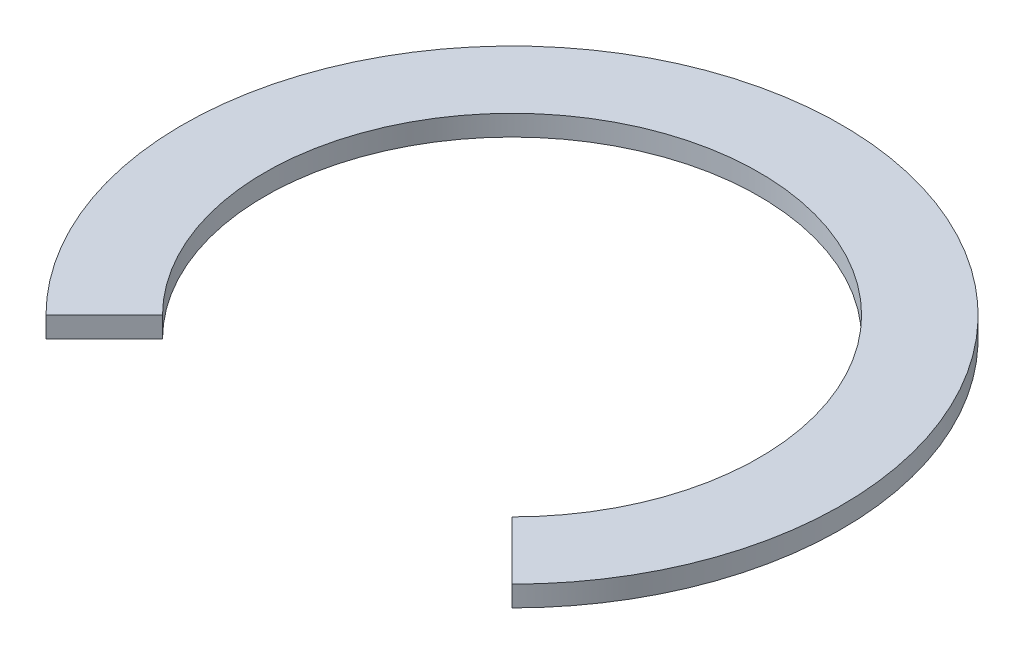
ISO-10303-21;
HEADER;
FILE_DESCRIPTION(('STEP AP214'),'2;1');
FILE_NAME('part.step','',(''),(''),'','','');
FILE_SCHEMA(('AUTOMOTIVE_DESIGN { 1 0 10303 214 1 1 1 1 }'));
ENDSEC;
DATA;
#1=APPLICATION_CONTEXT('core data for automotive mechanical design processes');
#2=APPLICATION_PROTOCOL_DEFINITION('international standard','automotive_design',2000,#1);
#3=PRODUCT_CONTEXT('',#1,'mechanical');
#4=PRODUCT('Part','Part','',(#3));
#5=PRODUCT_RELATED_PRODUCT_CATEGORY('part','',(#4));
#6=PRODUCT_DEFINITION_FORMATION('','',#4);
#7=PRODUCT_DEFINITION_CONTEXT('part definition',#1,'design');
#8=PRODUCT_DEFINITION('design','',#6,#7);
#9=PRODUCT_DEFINITION_SHAPE('','',#8);
#10=(LENGTH_UNIT() NAMED_UNIT(*) SI_UNIT(.MILLI.,.METRE.));
#11=(NAMED_UNIT(*) PLANE_ANGLE_UNIT() SI_UNIT($,.RADIAN.));
#12=(NAMED_UNIT(*) SI_UNIT($,.STERADIAN.) SOLID_ANGLE_UNIT());
#13=UNCERTAINTY_MEASURE_WITH_UNIT(LENGTH_MEASURE(1.E-05),#10,'distance_accuracy_value','');
#14=(GEOMETRIC_REPRESENTATION_CONTEXT(3) GLOBAL_UNCERTAINTY_ASSIGNED_CONTEXT((#13)) GLOBAL_UNIT_ASSIGNED_CONTEXT((#10,
#11,#12)) REPRESENTATION_CONTEXT('',''));
#15=CARTESIAN_POINT('',(0.,0.,0.));
#16=DIRECTION('',(0.,0.,1.));
#17=DIRECTION('',(1.,0.,0.));
#18=AXIS2_PLACEMENT_3D('',#15,#16,#17);
#19=CARTESIAN_POINT('',(0.,0.79375,0.));
#20=DIRECTION('',(0.,-1.,0.));
#21=DIRECTION('',(0.,0.,-1.));
#22=AXIS2_PLACEMENT_3D('',#19,#20,#21);
#23=CYLINDRICAL_SURFACE('',#22,12.7);
#24=CARTESIAN_POINT('',(0.,0.79375,0.));
#25=DIRECTION('',(0.,1.,0.));
#26=DIRECTION('',(0.,0.,1.));
#27=AXIS2_PLACEMENT_3D('',#24,#25,#26);
#28=CIRCLE('',#27,12.7);
#29=CARTESIAN_POINT('',(8.98025612106917,0.79375,8.98025612106914));
#30=VERTEX_POINT('',#29);
#31=CARTESIAN_POINT('',(-8.98025612106917,0.79375,8.98025612106914));
#32=VERTEX_POINT('',#31);
#33=EDGE_CURVE('E77',#30,#32,#28,.T.);
#34=ORIENTED_EDGE('',*,*,#33,.F.);
#35=DIRECTION('',(0.,-1.,0.));
#36=VECTOR('',#35,1.);
#37=CARTESIAN_POINT('',(8.98025612106917,0.79375,8.98025612106914));
#38=LINE('',#37,#36);
#39=CARTESIAN_POINT('',(8.98025612106917,0.,8.98025612106914));
#40=VERTEX_POINT('',#39);
#41=EDGE_CURVE('E88',#30,#40,#38,.T.);
#42=ORIENTED_EDGE('',*,*,#41,.T.);
#43=CARTESIAN_POINT('',(0.,0.,0.));
#44=DIRECTION('',(0.,1.,0.));
#45=DIRECTION('',(0.,0.,1.));
#46=AXIS2_PLACEMENT_3D('',#43,#44,#45);
#47=CIRCLE('',#46,12.7);
#48=CARTESIAN_POINT('',(-8.98025612106917,0.,8.98025612106914));
#49=VERTEX_POINT('',#48);
#50=EDGE_CURVE('E90',#40,#49,#47,.T.);
#51=ORIENTED_EDGE('',*,*,#50,.T.);
#52=DIRECTION('',(0.,-1.,0.));
#53=VECTOR('',#52,1.);
#54=CARTESIAN_POINT('',(-8.98025612106917,0.79375,8.98025612106914));
#55=LINE('',#54,#53);
#56=EDGE_CURVE('E84',#32,#49,#55,.T.);
#57=ORIENTED_EDGE('',*,*,#56,.F.);
#58=EDGE_LOOP('',(#34,#42,#51,#57));
#59=FACE_BOUND('',#58,.T.);
#60=ADVANCED_FACE('F33',(#59),#23,.T.);
#61=CARTESIAN_POINT('',(0.,0.79375,0.));
#62=DIRECTION('',(0.,1.,0.));
#63=DIRECTION('',(0.,0.,1.));
#64=AXIS2_PLACEMENT_3D('',#61,#62,#63);
#65=PLANE('',#64);
#66=DIRECTION('',(-0.707106781186549,0.,-0.707106781186546));
#67=VECTOR('',#66,1.);
#68=CARTESIAN_POINT('',(0.,0.79375,0.));
#69=LINE('',#68,#67);
#70=CARTESIAN_POINT('',(6.73519209080188,0.79375,6.73519209080185));
#71=VERTEX_POINT('',#70);
#72=EDGE_CURVE('E47',#30,#71,#69,.T.);
#73=ORIENTED_EDGE('',*,*,#72,.F.);
#74=ORIENTED_EDGE('',*,*,#33,.T.);
#75=DIRECTION('',(0.707106781186549,0.,-0.707106781186546));
#76=VECTOR('',#75,1.);
#77=CARTESIAN_POINT('',(0.,0.79375,0.));
#78=LINE('',#77,#76);
#79=CARTESIAN_POINT('',(-6.73519209080188,0.79375,6.73519209080185));
#80=VERTEX_POINT('',#79);
#81=EDGE_CURVE('E71',#32,#80,#78,.T.);
#82=ORIENTED_EDGE('',*,*,#81,.T.);
#83=CARTESIAN_POINT('',(0.,0.79375,0.));
#84=DIRECTION('',(0.,1.,0.));
#85=DIRECTION('',(0.,0.,1.));
#86=AXIS2_PLACEMENT_3D('',#83,#84,#85);
#87=CIRCLE('',#86,9.525);
#88=EDGE_CURVE('E82',#71,#80,#87,.T.);
#89=ORIENTED_EDGE('',*,*,#88,.F.);
#90=EDGE_LOOP('',(#73,#74,#82,#89));
#91=FACE_BOUND('',#90,.T.);
#92=ADVANCED_FACE('F81',(#91),#65,.T.);
#93=CARTESIAN_POINT('',(0.,0.,0.));
#94=DIRECTION('',(0.,1.,0.));
#95=DIRECTION('',(0.,0.,1.));
#96=AXIS2_PLACEMENT_3D('',#93,#94,#95);
#97=PLANE('',#96);
#98=ORIENTED_EDGE('',*,*,#50,.F.);
#99=DIRECTION('',(-0.707106781186549,0.,-0.707106781186546));
#100=VECTOR('',#99,1.);
#101=CARTESIAN_POINT('',(0.,0.,0.));
#102=LINE('',#101,#100);
#103=CARTESIAN_POINT('',(6.73519209080188,0.,6.73519209080185));
#104=VERTEX_POINT('',#103);
#105=EDGE_CURVE('E102',#40,#104,#102,.T.);
#106=ORIENTED_EDGE('',*,*,#105,.T.);
#107=CARTESIAN_POINT('',(0.,0.,0.));
#108=DIRECTION('',(0.,1.,0.));
#109=DIRECTION('',(0.,0.,1.));
#110=AXIS2_PLACEMENT_3D('',#107,#108,#109);
#111=CIRCLE('',#110,9.525);
#112=CARTESIAN_POINT('',(-6.73519209080188,0.,6.73519209080185));
#113=VERTEX_POINT('',#112);
#114=EDGE_CURVE('E87',#104,#113,#111,.T.);
#115=ORIENTED_EDGE('',*,*,#114,.T.);
#116=DIRECTION('',(0.707106781186549,0.,-0.707106781186546));
#117=VECTOR('',#116,1.);
#118=CARTESIAN_POINT('',(0.,0.,0.));
#119=LINE('',#118,#117);
#120=EDGE_CURVE('E54',#49,#113,#119,.T.);
#121=ORIENTED_EDGE('',*,*,#120,.F.);
#122=EDGE_LOOP('',(#98,#106,#115,#121));
#123=FACE_BOUND('',#122,.T.);
#124=ADVANCED_FACE('F101',(#123),#97,.F.);
#125=CARTESIAN_POINT('',(0.,0.,0.));
#126=DIRECTION('',(0.,1.,0.));
#127=DIRECTION('',(0.,0.,1.));
#128=AXIS2_PLACEMENT_3D('',#125,#126,#127);
#129=CYLINDRICAL_SURFACE('',#128,9.525);
#130=ORIENTED_EDGE('',*,*,#114,.F.);
#131=DIRECTION('',(0.,1.,0.));
#132=VECTOR('',#131,1.);
#133=CARTESIAN_POINT('',(6.73519209080188,0.,6.73519209080185));
#134=LINE('',#133,#132);
#135=EDGE_CURVE('E11',#104,#71,#134,.T.);
#136=ORIENTED_EDGE('',*,*,#135,.T.);
#137=ORIENTED_EDGE('',*,*,#88,.T.);
#138=DIRECTION('',(0.,1.,0.));
#139=VECTOR('',#138,1.);
#140=CARTESIAN_POINT('',(-6.73519209080188,0.,6.73519209080185));
#141=LINE('',#140,#139);
#142=EDGE_CURVE('E40',#113,#80,#141,.T.);
#143=ORIENTED_EDGE('',*,*,#142,.F.);
#144=EDGE_LOOP('',(#130,#136,#137,#143));
#145=FACE_BOUND('',#144,.T.);
#146=ADVANCED_FACE('F86',(#145),#129,.F.);
#147=CARTESIAN_POINT('',(0.,0.,0.));
#148=DIRECTION('',(0.707106781186546,0.,0.707106781186549));
#149=DIRECTION('',(0.707106781186549,0.,-0.707106781186546));
#150=AXIS2_PLACEMENT_3D('',#147,#148,#149);
#151=PLANE('',#150);
#152=ORIENTED_EDGE('',*,*,#56,.T.);
#153=ORIENTED_EDGE('',*,*,#120,.T.);
#154=ORIENTED_EDGE('',*,*,#142,.T.);
#155=ORIENTED_EDGE('',*,*,#81,.F.);
#156=EDGE_LOOP('',(#152,#153,#154,#155));
#157=FACE_BOUND('',#156,.T.);
#158=ADVANCED_FACE('F70',(#157),#151,.T.);
#159=CARTESIAN_POINT('',(0.,0.,0.));
#160=DIRECTION('',(0.707106781186546,0.,-0.707106781186549));
#161=DIRECTION('',(-0.707106781186549,0.,-0.707106781186546));
#162=AXIS2_PLACEMENT_3D('',#159,#160,#161);
#163=PLANE('',#162);
#164=ORIENTED_EDGE('',*,*,#72,.T.);
#165=ORIENTED_EDGE('',*,*,#135,.F.);
#166=ORIENTED_EDGE('',*,*,#105,.F.);
#167=ORIENTED_EDGE('',*,*,#41,.F.);
#168=EDGE_LOOP('',(#164,#165,#166,#167));
#169=FACE_BOUND('',#168,.T.);
#170=ADVANCED_FACE('F107',(#169),#163,.F.);
#171=CLOSED_SHELL('',(#60,#92,#124,#146,#158,#170));
#172=MANIFOLD_SOLID_BREP('B2',#171);
#173=ADVANCED_BREP_SHAPE_REPRESENTATION('',(#18,#172),#14);
#174=SHAPE_DEFINITION_REPRESENTATION(#9,#173);
ENDSEC;
END-ISO-10303-21;
